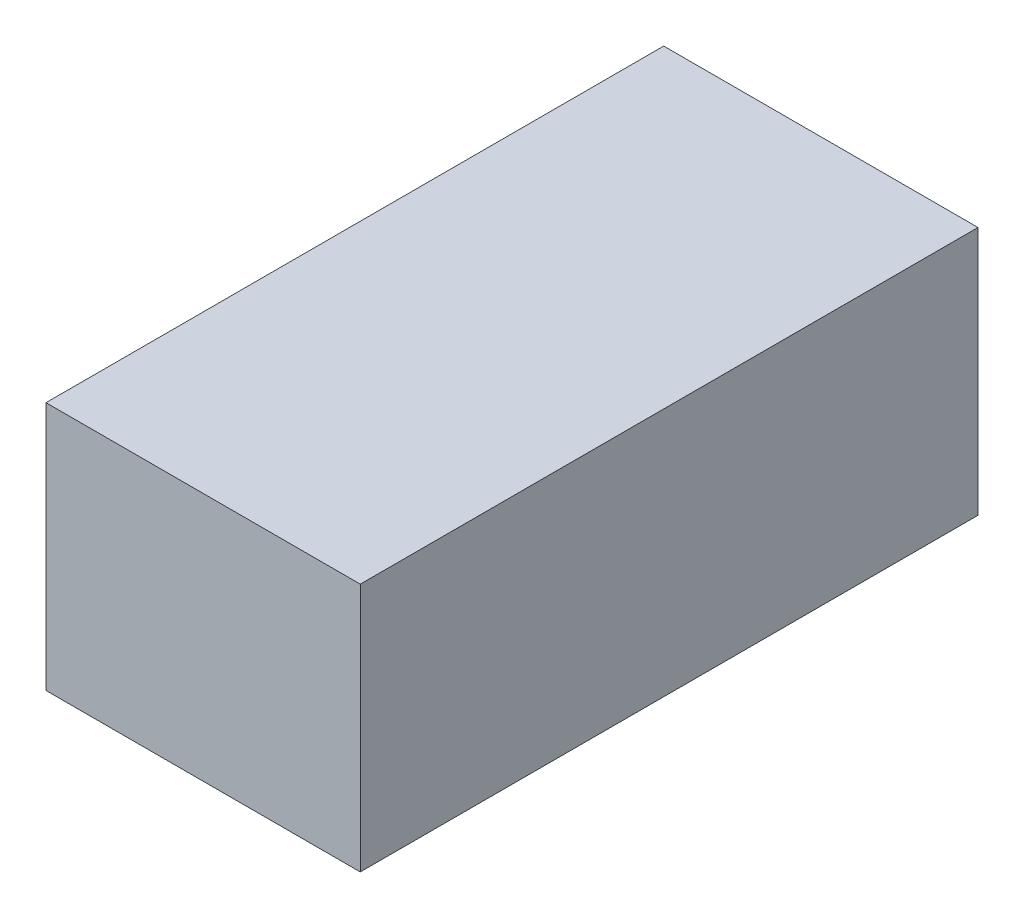
ISO-10303-21;
HEADER;
FILE_DESCRIPTION(('STEP AP214'),'2;1');
FILE_NAME('part.step','',(''),(''),'','','');
FILE_SCHEMA(('AUTOMOTIVE_DESIGN { 1 0 10303 214 1 1 1 1 }'));
ENDSEC;
DATA;
#1=APPLICATION_CONTEXT('core data for automotive mechanical design processes');
#2=APPLICATION_PROTOCOL_DEFINITION('international standard','automotive_design',2000,#1);
#3=PRODUCT_CONTEXT('',#1,'mechanical');
#4=PRODUCT('Part','Part','',(#3));
#5=PRODUCT_RELATED_PRODUCT_CATEGORY('part','',(#4));
#6=PRODUCT_DEFINITION_FORMATION('','',#4);
#7=PRODUCT_DEFINITION_CONTEXT('part definition',#1,'design');
#8=PRODUCT_DEFINITION('design','',#6,#7);
#9=PRODUCT_DEFINITION_SHAPE('','',#8);
#10=(LENGTH_UNIT() NAMED_UNIT(*) SI_UNIT(.MILLI.,.METRE.));
#11=(NAMED_UNIT(*) PLANE_ANGLE_UNIT() SI_UNIT($,.RADIAN.));
#12=(NAMED_UNIT(*) SI_UNIT($,.STERADIAN.) SOLID_ANGLE_UNIT());
#13=UNCERTAINTY_MEASURE_WITH_UNIT(LENGTH_MEASURE(1.E-05),#10,'distance_accuracy_value','');
#14=(GEOMETRIC_REPRESENTATION_CONTEXT(3) GLOBAL_UNCERTAINTY_ASSIGNED_CONTEXT((#13)) GLOBAL_UNIT_ASSIGNED_CONTEXT((#10,
#11,#12)) REPRESENTATION_CONTEXT('',''));
#15=CARTESIAN_POINT('',(0.,0.,0.));
#16=DIRECTION('',(0.,0.,1.));
#17=DIRECTION('',(1.,0.,0.));
#18=AXIS2_PLACEMENT_3D('',#15,#16,#17);
#19=CARTESIAN_POINT('',(14.5,-11.5,57.));
#20=DIRECTION('',(-1.,0.,0.));
#21=DIRECTION('',(0.,0.,1.));
#22=AXIS2_PLACEMENT_3D('',#19,#20,#21);
#23=PLANE('',#22);
#24=DIRECTION('',(0.,1.,0.));
#25=VECTOR('',#24,1.);
#26=CARTESIAN_POINT('',(14.5,-11.5,0.));
#27=LINE('',#26,#25);
#28=CARTESIAN_POINT('',(14.5,-11.5,0.));
#29=VERTEX_POINT('',#28);
#30=CARTESIAN_POINT('',(14.5,11.5,0.));
#31=VERTEX_POINT('',#30);
#32=EDGE_CURVE('E96',#29,#31,#27,.T.);
#33=ORIENTED_EDGE('',*,*,#32,.T.);
#34=DIRECTION('',(0.,0.,-1.));
#35=VECTOR('',#34,1.);
#36=CARTESIAN_POINT('',(14.5,11.5,57.));
#37=LINE('',#36,#35);
#38=CARTESIAN_POINT('',(14.5,11.5,57.));
#39=VERTEX_POINT('',#38);
#40=EDGE_CURVE('E11',#39,#31,#37,.T.);
#41=ORIENTED_EDGE('',*,*,#40,.F.);
#42=DIRECTION('',(0.,1.,0.));
#43=VECTOR('',#42,1.);
#44=CARTESIAN_POINT('',(14.5,-11.5,57.));
#45=LINE('',#44,#43);
#46=CARTESIAN_POINT('',(14.5,-11.5,57.));
#47=VERTEX_POINT('',#46);
#48=EDGE_CURVE('E84',#47,#39,#45,.T.);
#49=ORIENTED_EDGE('',*,*,#48,.F.);
#50=DIRECTION('',(0.,0.,-1.));
#51=VECTOR('',#50,1.);
#52=CARTESIAN_POINT('',(14.5,-11.5,57.));
#53=LINE('',#52,#51);
#54=EDGE_CURVE('E92',#47,#29,#53,.T.);
#55=ORIENTED_EDGE('',*,*,#54,.T.);
#56=EDGE_LOOP('',(#33,#41,#49,#55));
#57=FACE_BOUND('',#56,.T.);
#58=ADVANCED_FACE('F33',(#57),#23,.F.);
#59=CARTESIAN_POINT('',(-14.5,11.5,57.));
#60=DIRECTION('',(0.,-1.,0.));
#61=DIRECTION('',(0.,0.,-1.));
#62=AXIS2_PLACEMENT_3D('',#59,#60,#61);
#63=PLANE('',#62);
#64=DIRECTION('',(-1.,0.,0.));
#65=VECTOR('',#64,1.);
#66=CARTESIAN_POINT('',(-14.5,11.5,0.));
#67=LINE('',#66,#65);
#68=CARTESIAN_POINT('',(-14.5,11.5,0.));
#69=VERTEX_POINT('',#68);
#70=EDGE_CURVE('E88',#31,#69,#67,.T.);
#71=ORIENTED_EDGE('',*,*,#70,.T.);
#72=DIRECTION('',(0.,0.,-1.));
#73=VECTOR('',#72,1.);
#74=CARTESIAN_POINT('',(-14.5,11.5,57.));
#75=LINE('',#74,#73);
#76=CARTESIAN_POINT('',(-14.5,11.5,57.));
#77=VERTEX_POINT('',#76);
#78=EDGE_CURVE('E41',#77,#69,#75,.T.);
#79=ORIENTED_EDGE('',*,*,#78,.F.);
#80=DIRECTION('',(-1.,0.,0.));
#81=VECTOR('',#80,1.);
#82=CARTESIAN_POINT('',(-14.5,11.5,57.));
#83=LINE('',#82,#81);
#84=EDGE_CURVE('E79',#39,#77,#83,.T.);
#85=ORIENTED_EDGE('',*,*,#84,.F.);
#86=ORIENTED_EDGE('',*,*,#40,.T.);
#87=EDGE_LOOP('',(#71,#79,#85,#86));
#88=FACE_BOUND('',#87,.T.);
#89=ADVANCED_FACE('F87',(#88),#63,.F.);
#90=CARTESIAN_POINT('',(-14.5,-11.5,57.));
#91=DIRECTION('',(1.,0.,0.));
#92=DIRECTION('',(0.,0.,-1.));
#93=AXIS2_PLACEMENT_3D('',#90,#91,#92);
#94=PLANE('',#93);
#95=DIRECTION('',(0.,-1.,0.));
#96=VECTOR('',#95,1.);
#97=CARTESIAN_POINT('',(-14.5,-11.5,0.));
#98=LINE('',#97,#96);
#99=CARTESIAN_POINT('',(-14.5,-11.5,0.));
#100=VERTEX_POINT('',#99);
#101=EDGE_CURVE('E66',#69,#100,#98,.T.);
#102=ORIENTED_EDGE('',*,*,#101,.T.);
#103=DIRECTION('',(0.,0.,-1.));
#104=VECTOR('',#103,1.);
#105=CARTESIAN_POINT('',(-14.5,-11.5,57.));
#106=LINE('',#105,#104);
#107=CARTESIAN_POINT('',(-14.5,-11.5,57.));
#108=VERTEX_POINT('',#107);
#109=EDGE_CURVE('E89',#108,#100,#106,.T.);
#110=ORIENTED_EDGE('',*,*,#109,.F.);
#111=DIRECTION('',(0.,-1.,0.));
#112=VECTOR('',#111,1.);
#113=CARTESIAN_POINT('',(-14.5,-11.5,57.));
#114=LINE('',#113,#112);
#115=EDGE_CURVE('E82',#77,#108,#114,.T.);
#116=ORIENTED_EDGE('',*,*,#115,.F.);
#117=ORIENTED_EDGE('',*,*,#78,.T.);
#118=EDGE_LOOP('',(#102,#110,#116,#117));
#119=FACE_BOUND('',#118,.T.);
#120=ADVANCED_FACE('F90',(#119),#94,.F.);
#121=CARTESIAN_POINT('',(-14.5,-11.5,57.));
#122=DIRECTION('',(0.,1.,0.));
#123=DIRECTION('',(0.,0.,1.));
#124=AXIS2_PLACEMENT_3D('',#121,#122,#123);
#125=PLANE('',#124);
#126=DIRECTION('',(1.,0.,0.));
#127=VECTOR('',#126,1.);
#128=CARTESIAN_POINT('',(-14.5,-11.5,0.));
#129=LINE('',#128,#127);
#130=EDGE_CURVE('E72',#100,#29,#129,.T.);
#131=ORIENTED_EDGE('',*,*,#130,.T.);
#132=ORIENTED_EDGE('',*,*,#54,.F.);
#133=DIRECTION('',(1.,0.,0.));
#134=VECTOR('',#133,1.);
#135=CARTESIAN_POINT('',(-14.5,-11.5,57.));
#136=LINE('',#135,#134);
#137=EDGE_CURVE('E49',#108,#47,#136,.T.);
#138=ORIENTED_EDGE('',*,*,#137,.F.);
#139=ORIENTED_EDGE('',*,*,#109,.T.);
#140=EDGE_LOOP('',(#131,#132,#138,#139));
#141=FACE_BOUND('',#140,.T.);
#142=ADVANCED_FACE('F103',(#141),#125,.F.);
#143=CARTESIAN_POINT('',(0.,0.,57.));
#144=DIRECTION('',(0.,0.,-1.));
#145=DIRECTION('',(-1.,0.,0.));
#146=AXIS2_PLACEMENT_3D('',#143,#144,#145);
#147=PLANE('',#146);
#148=ORIENTED_EDGE('',*,*,#48,.T.);
#149=ORIENTED_EDGE('',*,*,#84,.T.);
#150=ORIENTED_EDGE('',*,*,#115,.T.);
#151=ORIENTED_EDGE('',*,*,#137,.T.);
#152=EDGE_LOOP('',(#148,#149,#150,#151));
#153=FACE_BOUND('',#152,.T.);
#154=ADVANCED_FACE('F80',(#153),#147,.F.);
#155=CARTESIAN_POINT('',(0.,0.,0.));
#156=DIRECTION('',(0.,0.,-1.));
#157=DIRECTION('',(-1.,0.,0.));
#158=AXIS2_PLACEMENT_3D('',#155,#156,#157);
#159=PLANE('',#158);
#160=ORIENTED_EDGE('',*,*,#32,.F.);
#161=ORIENTED_EDGE('',*,*,#130,.F.);
#162=ORIENTED_EDGE('',*,*,#101,.F.);
#163=ORIENTED_EDGE('',*,*,#70,.F.);
#164=EDGE_LOOP('',(#160,#161,#162,#163));
#165=FACE_BOUND('',#164,.T.);
#166=ADVANCED_FACE('F106',(#165),#159,.T.);
#167=CLOSED_SHELL('',(#58,#89,#120,#142,#154,#166));
#168=MANIFOLD_SOLID_BREP('B2',#167);
#169=ADVANCED_BREP_SHAPE_REPRESENTATION('',(#18,#168),#14);
#170=SHAPE_DEFINITION_REPRESENTATION(#9,#169);
ENDSEC;
END-ISO-10303-21;
